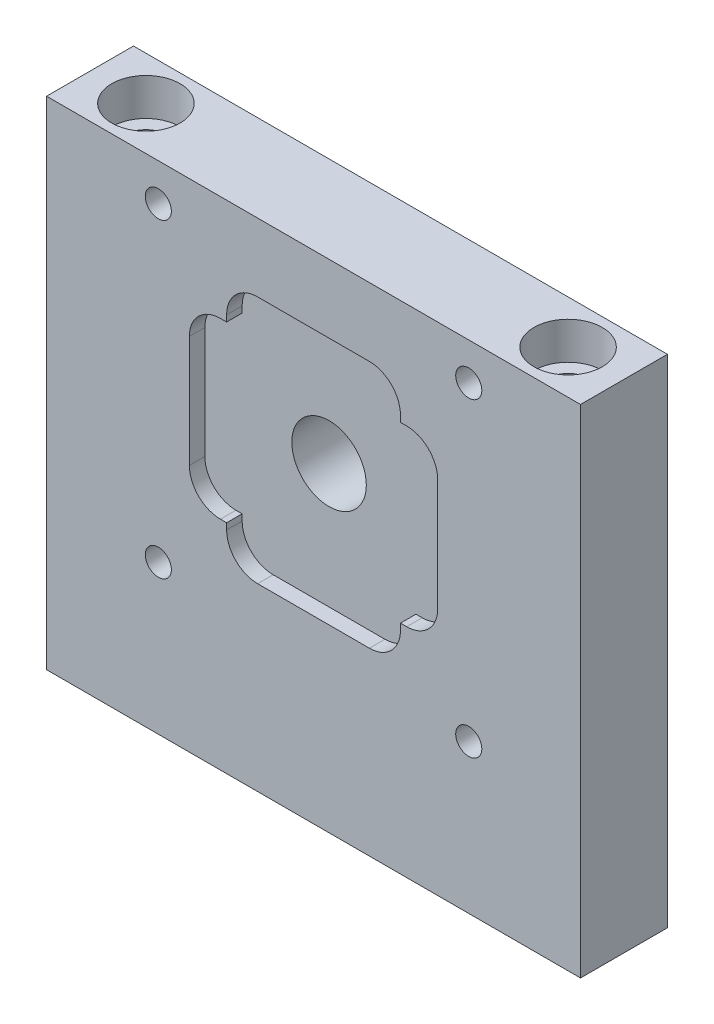
ISO-10303-21;
HEADER;
FILE_DESCRIPTION(('STEP AP214'),'2;1');
FILE_NAME('part.step','',(''),(''),'','','');
FILE_SCHEMA(('AUTOMOTIVE_DESIGN { 1 0 10303 214 1 1 1 1 }'));
ENDSEC;
DATA;
#1=APPLICATION_CONTEXT('core data for automotive mechanical design processes');
#2=APPLICATION_PROTOCOL_DEFINITION('international standard','automotive_design',2000,#1);
#3=PRODUCT_CONTEXT('',#1,'mechanical');
#4=PRODUCT('Part','Part','',(#3));
#5=PRODUCT_RELATED_PRODUCT_CATEGORY('part','',(#4));
#6=PRODUCT_DEFINITION_FORMATION('','',#4);
#7=PRODUCT_DEFINITION_CONTEXT('part definition',#1,'design');
#8=PRODUCT_DEFINITION('design','',#6,#7);
#9=PRODUCT_DEFINITION_SHAPE('','',#8);
#10=(LENGTH_UNIT() NAMED_UNIT(*) SI_UNIT(.MILLI.,.METRE.));
#11=(NAMED_UNIT(*) PLANE_ANGLE_UNIT() SI_UNIT($,.RADIAN.));
#12=(NAMED_UNIT(*) SI_UNIT($,.STERADIAN.) SOLID_ANGLE_UNIT());
#13=UNCERTAINTY_MEASURE_WITH_UNIT(LENGTH_MEASURE(1.E-05),#10,'distance_accuracy_value','');
#14=(GEOMETRIC_REPRESENTATION_CONTEXT(3) GLOBAL_UNCERTAINTY_ASSIGNED_CONTEXT((#13)) GLOBAL_UNIT_ASSIGNED_CONTEXT((#10,
#11,#12)) REPRESENTATION_CONTEXT('',''));
#15=CARTESIAN_POINT('',(0.,0.,0.));
#16=DIRECTION('',(0.,0.,1.));
#17=DIRECTION('',(1.,0.,0.));
#18=AXIS2_PLACEMENT_3D('',#15,#16,#17);
#19=CARTESIAN_POINT('',(0.,0.,14.));
#20=DIRECTION('',(1.,0.,0.));
#21=DIRECTION('',(0.,0.,-1.));
#22=AXIS2_PLACEMENT_3D('',#19,#20,#21);
#23=PLANE('',#22);
#24=DIRECTION('',(0.,-1.,0.));
#25=VECTOR('',#24,1.);
#26=CARTESIAN_POINT('',(0.,0.,0.));
#27=LINE('',#26,#25);
#28=CARTESIAN_POINT('',(0.,80.,0.));
#29=VERTEX_POINT('',#28);
#30=CARTESIAN_POINT('',(0.,0.,0.));
#31=VERTEX_POINT('',#30);
#32=EDGE_CURVE('E288',#29,#31,#27,.T.);
#33=ORIENTED_EDGE('',*,*,#32,.T.);
#34=DIRECTION('',(0.,0.,-1.));
#35=VECTOR('',#34,1.);
#36=CARTESIAN_POINT('',(0.,0.,14.));
#37=LINE('',#36,#35);
#38=CARTESIAN_POINT('',(0.,0.,14.));
#39=VERTEX_POINT('',#38);
#40=EDGE_CURVE('E315',#39,#31,#37,.T.);
#41=ORIENTED_EDGE('',*,*,#40,.F.);
#42=DIRECTION('',(0.,-1.,0.));
#43=VECTOR('',#42,1.);
#44=CARTESIAN_POINT('',(0.,0.,14.));
#45=LINE('',#44,#43);
#46=CARTESIAN_POINT('',(0.,80.,14.));
#47=VERTEX_POINT('',#46);
#48=EDGE_CURVE('E289',#47,#39,#45,.T.);
#49=ORIENTED_EDGE('',*,*,#48,.F.);
#50=DIRECTION('',(0.,0.,-1.));
#51=VECTOR('',#50,1.);
#52=CARTESIAN_POINT('',(0.,80.,14.));
#53=LINE('',#52,#51);
#54=EDGE_CURVE('E299',#47,#29,#53,.T.);
#55=ORIENTED_EDGE('',*,*,#54,.T.);
#56=EDGE_LOOP('',(#33,#41,#49,#55));
#57=FACE_BOUND('',#56,.T.);
#58=ADVANCED_FACE('F33',(#57),#23,.F.);
#59=CARTESIAN_POINT('',(0.,0.,14.));
#60=DIRECTION('',(0.,1.,0.));
#61=DIRECTION('',(0.,0.,1.));
#62=AXIS2_PLACEMENT_3D('',#59,#60,#61);
#63=PLANE('',#62);
#64=CARTESIAN_POINT('',(8.99999999999999,0.,7.));
#65=DIRECTION('',(0.,1.,0.));
#66=DIRECTION('',(0.,0.,1.));
#67=AXIS2_PLACEMENT_3D('',#64,#65,#66);
#68=CIRCLE('',#67,3.29999999999998);
#69=CARTESIAN_POINT('',(8.99999999999999,0.,10.3));
#70=VERTEX_POINT('',#69);
#71=EDGE_CURVE('E849',#70,#70,#68,.T.);
#72=ORIENTED_EDGE('',*,*,#71,.T.);
#73=EDGE_LOOP('',(#72));
#74=FACE_BOUND('',#73,.T.);
#75=CARTESIAN_POINT('',(77.,0.,7.));
#76=DIRECTION('',(0.,1.,0.));
#77=DIRECTION('',(0.,0.,1.));
#78=AXIS2_PLACEMENT_3D('',#75,#76,#77);
#79=CIRCLE('',#78,3.29999999999998);
#80=CARTESIAN_POINT('',(77.,0.,10.3));
#81=VERTEX_POINT('',#80);
#82=EDGE_CURVE('E248',#81,#81,#79,.T.);
#83=ORIENTED_EDGE('',*,*,#82,.T.);
#84=EDGE_LOOP('',(#83));
#85=FACE_BOUND('',#84,.T.);
#86=DIRECTION('',(1.,0.,0.));
#87=VECTOR('',#86,1.);
#88=CARTESIAN_POINT('',(0.,0.,0.));
#89=LINE('',#88,#87);
#90=CARTESIAN_POINT('',(86.,0.,0.));
#91=VERTEX_POINT('',#90);
#92=EDGE_CURVE('E302',#31,#91,#89,.T.);
#93=ORIENTED_EDGE('',*,*,#92,.T.);
#94=DIRECTION('',(0.,0.,-1.));
#95=VECTOR('',#94,1.);
#96=CARTESIAN_POINT('',(86.,0.,14.));
#97=LINE('',#96,#95);
#98=CARTESIAN_POINT('',(86.,0.,14.));
#99=VERTEX_POINT('',#98);
#100=EDGE_CURVE('E312',#99,#91,#97,.T.);
#101=ORIENTED_EDGE('',*,*,#100,.F.);
#102=DIRECTION('',(1.,0.,0.));
#103=VECTOR('',#102,1.);
#104=CARTESIAN_POINT('',(0.,0.,14.));
#105=LINE('',#104,#103);
#106=EDGE_CURVE('E292',#39,#99,#105,.T.);
#107=ORIENTED_EDGE('',*,*,#106,.F.);
#108=ORIENTED_EDGE('',*,*,#40,.T.);
#109=EDGE_LOOP('',(#93,#101,#107,#108));
#110=FACE_BOUND('',#109,.T.);
#111=ADVANCED_FACE('F467',(#74,#85,#110),#63,.F.);
#112=CARTESIAN_POINT('',(86.,0.,14.));
#113=DIRECTION('',(-1.,0.,0.));
#114=DIRECTION('',(0.,0.,1.));
#115=AXIS2_PLACEMENT_3D('',#112,#113,#114);
#116=PLANE('',#115);
#117=DIRECTION('',(0.,1.,0.));
#118=VECTOR('',#117,1.);
#119=CARTESIAN_POINT('',(86.,0.,0.));
#120=LINE('',#119,#118);
#121=CARTESIAN_POINT('',(86.,80.,0.));
#122=VERTEX_POINT('',#121);
#123=EDGE_CURVE('E304',#91,#122,#120,.T.);
#124=ORIENTED_EDGE('',*,*,#123,.T.);
#125=DIRECTION('',(0.,0.,-1.));
#126=VECTOR('',#125,1.);
#127=CARTESIAN_POINT('',(86.,80.,14.));
#128=LINE('',#127,#126);
#129=CARTESIAN_POINT('',(86.,80.,14.));
#130=VERTEX_POINT('',#129);
#131=EDGE_CURVE('E309',#130,#122,#128,.T.);
#132=ORIENTED_EDGE('',*,*,#131,.F.);
#133=DIRECTION('',(0.,1.,0.));
#134=VECTOR('',#133,1.);
#135=CARTESIAN_POINT('',(86.,0.,14.));
#136=LINE('',#135,#134);
#137=EDGE_CURVE('E295',#99,#130,#136,.T.);
#138=ORIENTED_EDGE('',*,*,#137,.F.);
#139=ORIENTED_EDGE('',*,*,#100,.T.);
#140=EDGE_LOOP('',(#124,#132,#138,#139));
#141=FACE_BOUND('',#140,.T.);
#142=ADVANCED_FACE('F473',(#141),#116,.F.);
#143=CARTESIAN_POINT('',(0.,80.,14.));
#144=DIRECTION('',(0.,-1.,0.));
#145=DIRECTION('',(0.,0.,-1.));
#146=AXIS2_PLACEMENT_3D('',#143,#144,#145);
#147=PLANE('',#146);
#148=CARTESIAN_POINT('',(8.99999999999999,80.,7.));
#149=DIRECTION('',(0.,1.,0.));
#150=DIRECTION('',(0.,0.,1.));
#151=AXIS2_PLACEMENT_3D('',#148,#149,#150);
#152=CIRCLE('',#151,5.5);
#153=CARTESIAN_POINT('',(8.99999999999999,80.,12.5));
#154=VERTEX_POINT('',#153);
#155=EDGE_CURVE('E840',#154,#154,#152,.T.);
#156=ORIENTED_EDGE('',*,*,#155,.F.);
#157=EDGE_LOOP('',(#156));
#158=FACE_BOUND('',#157,.T.);
#159=CARTESIAN_POINT('',(77.,80.,7.));
#160=DIRECTION('',(0.,1.,0.));
#161=DIRECTION('',(0.,0.,1.));
#162=AXIS2_PLACEMENT_3D('',#159,#160,#161);
#163=CIRCLE('',#162,5.50000000000001);
#164=CARTESIAN_POINT('',(77.,80.,12.5));
#165=VERTEX_POINT('',#164);
#166=EDGE_CURVE('E852',#165,#165,#163,.T.);
#167=ORIENTED_EDGE('',*,*,#166,.F.);
#168=EDGE_LOOP('',(#167));
#169=FACE_BOUND('',#168,.T.);
#170=DIRECTION('',(-1.,0.,0.));
#171=VECTOR('',#170,1.);
#172=CARTESIAN_POINT('',(0.,80.,0.));
#173=LINE('',#172,#171);
#174=EDGE_CURVE('E293',#122,#29,#173,.T.);
#175=ORIENTED_EDGE('',*,*,#174,.T.);
#176=ORIENTED_EDGE('',*,*,#54,.F.);
#177=DIRECTION('',(-1.,0.,0.));
#178=VECTOR('',#177,1.);
#179=CARTESIAN_POINT('',(0.,80.,14.));
#180=LINE('',#179,#178);
#181=EDGE_CURVE('E297',#130,#47,#180,.T.);
#182=ORIENTED_EDGE('',*,*,#181,.F.);
#183=ORIENTED_EDGE('',*,*,#131,.T.);
#184=EDGE_LOOP('',(#175,#176,#182,#183));
#185=FACE_BOUND('',#184,.T.);
#186=ADVANCED_FACE('F521',(#158,#169,#185),#147,.F.);
#187=CARTESIAN_POINT('',(0.,80.,14.));
#188=DIRECTION('',(0.,0.,-1.));
#189=DIRECTION('',(-1.,0.,0.));
#190=AXIS2_PLACEMENT_3D('',#187,#188,#189);
#191=PLANE('',#190);
#192=CARTESIAN_POINT('',(68.0000000000001,74.,14.));
#193=DIRECTION('',(0.,0.,1.));
#194=DIRECTION('',(1.,0.,0.));
#195=AXIS2_PLACEMENT_3D('',#192,#193,#194);
#196=CIRCLE('',#195,2.09999999999999);
#197=CARTESIAN_POINT('',(70.1000000000001,74.,14.));
#198=VERTEX_POINT('',#197);
#199=EDGE_CURVE('E818',#198,#198,#196,.T.);
#200=ORIENTED_EDGE('',*,*,#199,.F.);
#201=EDGE_LOOP('',(#200));
#202=FACE_BOUND('',#201,.T.);
#203=CARTESIAN_POINT('',(18.0000000000001,74.,14.));
#204=DIRECTION('',(0.,0.,1.));
#205=DIRECTION('',(1.,0.,0.));
#206=AXIS2_PLACEMENT_3D('',#203,#204,#205);
#207=CIRCLE('',#206,2.09999999999999);
#208=CARTESIAN_POINT('',(20.1000000000001,74.,14.));
#209=VERTEX_POINT('',#208);
#210=EDGE_CURVE('E820',#209,#209,#207,.T.);
#211=ORIENTED_EDGE('',*,*,#210,.F.);
#212=EDGE_LOOP('',(#211));
#213=FACE_BOUND('',#212,.T.);
#214=CARTESIAN_POINT('',(18.0000000000001,24.,14.));
#215=DIRECTION('',(0.,0.,1.));
#216=DIRECTION('',(1.,0.,0.));
#217=AXIS2_PLACEMENT_3D('',#214,#215,#216);
#218=CIRCLE('',#217,2.09999999999999);
#219=CARTESIAN_POINT('',(20.1000000000001,24.,14.));
#220=VERTEX_POINT('',#219);
#221=EDGE_CURVE('E828',#220,#220,#218,.T.);
#222=ORIENTED_EDGE('',*,*,#221,.F.);
#223=EDGE_LOOP('',(#222));
#224=FACE_BOUND('',#223,.T.);
#225=CARTESIAN_POINT('',(68.0000000000001,24.,14.));
#226=DIRECTION('',(0.,0.,1.));
#227=DIRECTION('',(1.,0.,0.));
#228=AXIS2_PLACEMENT_3D('',#225,#226,#227);
#229=CIRCLE('',#228,2.09999999999999);
#230=CARTESIAN_POINT('',(70.1000000000001,24.,14.));
#231=VERTEX_POINT('',#230);
#232=EDGE_CURVE('E834',#231,#231,#229,.T.);
#233=ORIENTED_EDGE('',*,*,#232,.F.);
#234=EDGE_LOOP('',(#233));
#235=FACE_BOUND('',#234,.T.);
#236=DIRECTION('',(-1.,0.,0.));
#237=VECTOR('',#236,1.);
#238=CARTESIAN_POINT('',(29.,63.,14.));
#239=LINE('',#238,#237);
#240=CARTESIAN_POINT('',(29.,63.,14.));
#241=VERTEX_POINT('',#240);
#242=CARTESIAN_POINT('',(28.,63.,14.));
#243=VERTEX_POINT('',#242);
#244=EDGE_CURVE('E247',#241,#243,#239,.T.);
#245=ORIENTED_EDGE('',*,*,#244,.F.);
#246=DIRECTION('',(0.,-1.,0.));
#247=VECTOR('',#246,1.);
#248=CARTESIAN_POINT('',(29.,69.,14.));
#249=LINE('',#248,#247);
#250=CARTESIAN_POINT('',(29.,64.,14.));
#251=VERTEX_POINT('',#250);
#252=EDGE_CURVE('E211',#251,#241,#249,.T.);
#253=ORIENTED_EDGE('',*,*,#252,.F.);
#254=CARTESIAN_POINT('',(34.,64.,14.));
#255=DIRECTION('',(0.,0.,-1.));
#256=DIRECTION('',(-1.,0.,0.));
#257=AXIS2_PLACEMENT_3D('',#254,#255,#256);
#258=CIRCLE('',#257,5.);
#259=CARTESIAN_POINT('',(34.,69.,14.));
#260=VERTEX_POINT('',#259);
#261=EDGE_CURVE('E11',#251,#260,#258,.T.);
#262=ORIENTED_EDGE('',*,*,#261,.T.);
#263=DIRECTION('',(-1.,0.,0.));
#264=VECTOR('',#263,1.);
#265=CARTESIAN_POINT('',(57.,69.,14.));
#266=LINE('',#265,#264);
#267=CARTESIAN_POINT('',(52.,69.,14.));
#268=VERTEX_POINT('',#267);
#269=EDGE_CURVE('E205',#268,#260,#266,.T.);
#270=ORIENTED_EDGE('',*,*,#269,.F.);
#271=CARTESIAN_POINT('',(52.,64.,14.));
#272=DIRECTION('',(0.,0.,-1.));
#273=DIRECTION('',(-1.,0.,0.));
#274=AXIS2_PLACEMENT_3D('',#271,#272,#273);
#275=CIRCLE('',#274,5.);
#276=CARTESIAN_POINT('',(57.,64.,14.));
#277=VERTEX_POINT('',#276);
#278=EDGE_CURVE('E373',#268,#277,#275,.T.);
#279=ORIENTED_EDGE('',*,*,#278,.T.);
#280=DIRECTION('',(0.,1.,0.));
#281=VECTOR('',#280,1.);
#282=CARTESIAN_POINT('',(57.,69.,14.));
#283=LINE('',#282,#281);
#284=CARTESIAN_POINT('',(57.,63.,14.));
#285=VERTEX_POINT('',#284);
#286=EDGE_CURVE('E271',#285,#277,#283,.T.);
#287=ORIENTED_EDGE('',*,*,#286,.F.);
#288=DIRECTION('',(-1.,0.,0.));
#289=VECTOR('',#288,1.);
#290=CARTESIAN_POINT('',(57.,63.,14.));
#291=LINE('',#290,#289);
#292=CARTESIAN_POINT('',(58.,63.,14.));
#293=VERTEX_POINT('',#292);
#294=EDGE_CURVE('E269',#293,#285,#291,.T.);
#295=ORIENTED_EDGE('',*,*,#294,.F.);
#296=CARTESIAN_POINT('',(58.,58.,14.));
#297=DIRECTION('',(0.,0.,-1.));
#298=DIRECTION('',(-1.,0.,0.));
#299=AXIS2_PLACEMENT_3D('',#296,#297,#298);
#300=CIRCLE('',#299,5.);
#301=CARTESIAN_POINT('',(63.,58.,14.));
#302=VERTEX_POINT('',#301);
#303=EDGE_CURVE('E375',#293,#302,#300,.T.);
#304=ORIENTED_EDGE('',*,*,#303,.T.);
#305=DIRECTION('',(0.,1.,0.));
#306=VECTOR('',#305,1.);
#307=CARTESIAN_POINT('',(63.,63.,14.));
#308=LINE('',#307,#306);
#309=CARTESIAN_POINT('',(63.,40.,14.));
#310=VERTEX_POINT('',#309);
#311=EDGE_CURVE('E266',#310,#302,#308,.T.);
#312=ORIENTED_EDGE('',*,*,#311,.F.);
#313=CARTESIAN_POINT('',(58.,40.,14.));
#314=DIRECTION('',(0.,0.,-1.));
#315=DIRECTION('',(-1.,0.,0.));
#316=AXIS2_PLACEMENT_3D('',#313,#314,#315);
#317=CIRCLE('',#316,5.);
#318=CARTESIAN_POINT('',(58.,35.,14.));
#319=VERTEX_POINT('',#318);
#320=EDGE_CURVE('E377',#310,#319,#317,.T.);
#321=ORIENTED_EDGE('',*,*,#320,.T.);
#322=DIRECTION('',(1.,0.,0.));
#323=VECTOR('',#322,1.);
#324=CARTESIAN_POINT('',(57.,35.,14.));
#325=LINE('',#324,#323);
#326=CARTESIAN_POINT('',(57.,35.,14.));
#327=VERTEX_POINT('',#326);
#328=EDGE_CURVE('E263',#327,#319,#325,.T.);
#329=ORIENTED_EDGE('',*,*,#328,.F.);
#330=DIRECTION('',(0.,1.,0.));
#331=VECTOR('',#330,1.);
#332=CARTESIAN_POINT('',(57.,29.,14.));
#333=LINE('',#332,#331);
#334=CARTESIAN_POINT('',(57.,34.,14.));
#335=VERTEX_POINT('',#334);
#336=EDGE_CURVE('E261',#335,#327,#333,.T.);
#337=ORIENTED_EDGE('',*,*,#336,.F.);
#338=CARTESIAN_POINT('',(52.,34.,14.));
#339=DIRECTION('',(0.,0.,-1.));
#340=DIRECTION('',(-1.,0.,0.));
#341=AXIS2_PLACEMENT_3D('',#338,#339,#340);
#342=CIRCLE('',#341,5.);
#343=CARTESIAN_POINT('',(52.,29.,14.));
#344=VERTEX_POINT('',#343);
#345=EDGE_CURVE('E379',#335,#344,#342,.T.);
#346=ORIENTED_EDGE('',*,*,#345,.T.);
#347=DIRECTION('',(1.,0.,0.));
#348=VECTOR('',#347,1.);
#349=CARTESIAN_POINT('',(57.,29.,14.));
#350=LINE('',#349,#348);
#351=CARTESIAN_POINT('',(34.,29.,14.));
#352=VERTEX_POINT('',#351);
#353=EDGE_CURVE('E258',#352,#344,#350,.T.);
#354=ORIENTED_EDGE('',*,*,#353,.F.);
#355=CARTESIAN_POINT('',(34.,34.,14.));
#356=DIRECTION('',(0.,0.,-1.));
#357=DIRECTION('',(-1.,0.,0.));
#358=AXIS2_PLACEMENT_3D('',#355,#356,#357);
#359=CIRCLE('',#358,5.);
#360=CARTESIAN_POINT('',(29.,34.,14.));
#361=VERTEX_POINT('',#360);
#362=EDGE_CURVE('E381',#352,#361,#359,.T.);
#363=ORIENTED_EDGE('',*,*,#362,.T.);
#364=DIRECTION('',(0.,-1.,0.));
#365=VECTOR('',#364,1.);
#366=CARTESIAN_POINT('',(29.,29.,14.));
#367=LINE('',#366,#365);
#368=CARTESIAN_POINT('',(29.,35.,14.));
#369=VERTEX_POINT('',#368);
#370=EDGE_CURVE('E255',#369,#361,#367,.T.);
#371=ORIENTED_EDGE('',*,*,#370,.F.);
#372=DIRECTION('',(1.,0.,0.));
#373=VECTOR('',#372,1.);
#374=CARTESIAN_POINT('',(29.,35.,14.));
#375=LINE('',#374,#373);
#376=CARTESIAN_POINT('',(28.,35.,14.));
#377=VERTEX_POINT('',#376);
#378=EDGE_CURVE('E253',#377,#369,#375,.T.);
#379=ORIENTED_EDGE('',*,*,#378,.F.);
#380=CARTESIAN_POINT('',(28.,40.,14.));
#381=DIRECTION('',(0.,0.,-1.));
#382=DIRECTION('',(-1.,0.,0.));
#383=AXIS2_PLACEMENT_3D('',#380,#381,#382);
#384=CIRCLE('',#383,5.);
#385=CARTESIAN_POINT('',(23.,40.,14.));
#386=VERTEX_POINT('',#385);
#387=EDGE_CURVE('E383',#377,#386,#384,.T.);
#388=ORIENTED_EDGE('',*,*,#387,.T.);
#389=DIRECTION('',(0.,-1.,0.));
#390=VECTOR('',#389,1.);
#391=CARTESIAN_POINT('',(23.,63.,14.));
#392=LINE('',#391,#390);
#393=CARTESIAN_POINT('',(23.,58.,14.));
#394=VERTEX_POINT('',#393);
#395=EDGE_CURVE('E250',#394,#386,#392,.T.);
#396=ORIENTED_EDGE('',*,*,#395,.F.);
#397=CARTESIAN_POINT('',(28.,58.,14.));
#398=DIRECTION('',(0.,0.,-1.));
#399=DIRECTION('',(-1.,0.,0.));
#400=AXIS2_PLACEMENT_3D('',#397,#398,#399);
#401=CIRCLE('',#400,5.);
#402=EDGE_CURVE('E41',#394,#243,#401,.T.);
#403=ORIENTED_EDGE('',*,*,#402,.T.);
#404=EDGE_LOOP('',(#245,#253,#262,#270,#279,#287,#295,#304,#312,#321,#329,#337,#346,#354,#363,
#371,#379,#388,#396,#403));
#405=FACE_BOUND('',#404,.T.);
#406=ORIENTED_EDGE('',*,*,#48,.T.);
#407=ORIENTED_EDGE('',*,*,#106,.T.);
#408=ORIENTED_EDGE('',*,*,#137,.T.);
#409=ORIENTED_EDGE('',*,*,#181,.T.);
#410=EDGE_LOOP('',(#406,#407,#408,#409));
#411=FACE_BOUND('',#410,.T.);
#412=ADVANCED_FACE('F385',(#202,#213,#224,#235,#405,#411),#191,.F.);
#413=CARTESIAN_POINT('',(0.,80.,0.));
#414=DIRECTION('',(0.,0.,-1.));
#415=DIRECTION('',(-1.,0.,0.));
#416=AXIS2_PLACEMENT_3D('',#413,#414,#415);
#417=PLANE('',#416);
#418=CARTESIAN_POINT('',(68.0000000000001,74.,0.));
#419=DIRECTION('',(0.,0.,1.));
#420=DIRECTION('',(1.,0.,0.));
#421=AXIS2_PLACEMENT_3D('',#418,#419,#420);
#422=CIRCLE('',#421,2.09999999999999);
#423=CARTESIAN_POINT('',(70.1000000000001,74.,0.));
#424=VERTEX_POINT('',#423);
#425=EDGE_CURVE('E815',#424,#424,#422,.T.);
#426=ORIENTED_EDGE('',*,*,#425,.T.);
#427=EDGE_LOOP('',(#426));
#428=FACE_BOUND('',#427,.T.);
#429=CARTESIAN_POINT('',(18.0000000000001,74.,0.));
#430=DIRECTION('',(0.,0.,1.));
#431=DIRECTION('',(1.,0.,0.));
#432=AXIS2_PLACEMENT_3D('',#429,#430,#431);
#433=CIRCLE('',#432,2.1);
#434=CARTESIAN_POINT('',(20.1000000000001,74.,0.));
#435=VERTEX_POINT('',#434);
#436=EDGE_CURVE('E825',#435,#435,#433,.T.);
#437=ORIENTED_EDGE('',*,*,#436,.T.);
#438=EDGE_LOOP('',(#437));
#439=FACE_BOUND('',#438,.T.);
#440=CARTESIAN_POINT('',(18.0000000000001,24.,0.));
#441=DIRECTION('',(0.,0.,1.));
#442=DIRECTION('',(1.,0.,0.));
#443=AXIS2_PLACEMENT_3D('',#440,#441,#442);
#444=CIRCLE('',#443,2.1);
#445=CARTESIAN_POINT('',(20.1000000000001,24.,0.));
#446=VERTEX_POINT('',#445);
#447=EDGE_CURVE('E831',#446,#446,#444,.T.);
#448=ORIENTED_EDGE('',*,*,#447,.T.);
#449=EDGE_LOOP('',(#448));
#450=FACE_BOUND('',#449,.T.);
#451=CARTESIAN_POINT('',(68.0000000000001,24.,0.));
#452=DIRECTION('',(0.,0.,1.));
#453=DIRECTION('',(1.,0.,0.));
#454=AXIS2_PLACEMENT_3D('',#451,#452,#453);
#455=CIRCLE('',#454,2.09999999999999);
#456=CARTESIAN_POINT('',(70.1000000000001,24.,0.));
#457=VERTEX_POINT('',#456);
#458=EDGE_CURVE('E837',#457,#457,#455,.T.);
#459=ORIENTED_EDGE('',*,*,#458,.T.);
#460=EDGE_LOOP('',(#459));
#461=FACE_BOUND('',#460,.T.);
#462=CARTESIAN_POINT('',(43.,49.,0.));
#463=DIRECTION('',(0.,0.,1.));
#464=DIRECTION('',(1.,0.,0.));
#465=AXIS2_PLACEMENT_3D('',#462,#463,#464);
#466=CIRCLE('',#465,6.);
#467=CARTESIAN_POINT('',(49.,49.,0.));
#468=VERTEX_POINT('',#467);
#469=EDGE_CURVE('E285',#468,#468,#466,.T.);
#470=ORIENTED_EDGE('',*,*,#469,.T.);
#471=EDGE_LOOP('',(#470));
#472=FACE_BOUND('',#471,.T.);
#473=ORIENTED_EDGE('',*,*,#32,.F.);
#474=ORIENTED_EDGE('',*,*,#174,.F.);
#475=ORIENTED_EDGE('',*,*,#123,.F.);
#476=ORIENTED_EDGE('',*,*,#92,.F.);
#477=EDGE_LOOP('',(#473,#474,#475,#476));
#478=FACE_BOUND('',#477,.T.);
#479=ADVANCED_FACE('F595',(#428,#439,#450,#461,#472,#478),#417,.T.);
#480=CARTESIAN_POINT('',(43.,49.,0.));
#481=DIRECTION('',(0.,0.,1.));
#482=DIRECTION('',(1.,0.,0.));
#483=AXIS2_PLACEMENT_3D('',#480,#481,#482);
#484=CYLINDRICAL_SURFACE('',#483,6.);
#485=CARTESIAN_POINT('',(43.,49.,11.5));
#486=DIRECTION('',(0.,0.,-1.));
#487=DIRECTION('',(-1.,0.,0.));
#488=AXIS2_PLACEMENT_3D('',#485,#486,#487);
#489=CIRCLE('',#488,6.);
#490=CARTESIAN_POINT('',(37.,49.,11.5));
#491=VERTEX_POINT('',#490);
#492=EDGE_CURVE('E279',#491,#491,#489,.F.);
#493=ORIENTED_EDGE('',*,*,#492,.T.);
#494=EDGE_LOOP('',(#493));
#495=FACE_BOUND('',#494,.T.);
#496=ORIENTED_EDGE('',*,*,#469,.F.);
#497=EDGE_LOOP('',(#496));
#498=FACE_BOUND('',#497,.T.);
#499=ADVANCED_FACE('F605',(#495,#498),#484,.F.);
#500=CARTESIAN_POINT('',(29.,63.,11.5));
#501=DIRECTION('',(0.,0.,-1.));
#502=DIRECTION('',(-1.,0.,0.));
#503=AXIS2_PLACEMENT_3D('',#500,#501,#502);
#504=PLANE('',#503);
#505=DIRECTION('',(0.,1.,0.));
#506=VECTOR('',#505,1.);
#507=CARTESIAN_POINT('',(57.,69.,11.5));
#508=LINE('',#507,#506);
#509=CARTESIAN_POINT('',(57.,63.,11.5));
#510=VERTEX_POINT('',#509);
#511=CARTESIAN_POINT('',(57.,64.,11.5));
#512=VERTEX_POINT('',#511);
#513=EDGE_CURVE('E243',#510,#512,#508,.T.);
#514=ORIENTED_EDGE('',*,*,#513,.T.);
#515=CARTESIAN_POINT('',(52.,64.,11.5));
#516=DIRECTION('',(0.,0.,-1.));
#517=DIRECTION('',(-1.,0.,0.));
#518=AXIS2_PLACEMENT_3D('',#515,#516,#517);
#519=CIRCLE('',#518,5.);
#520=CARTESIAN_POINT('',(52.,69.,11.5));
#521=VERTEX_POINT('',#520);
#522=EDGE_CURVE('E340',#512,#521,#519,.F.);
#523=ORIENTED_EDGE('',*,*,#522,.T.);
#524=DIRECTION('',(-1.,0.,0.));
#525=VECTOR('',#524,1.);
#526=CARTESIAN_POINT('',(57.,69.,11.5));
#527=LINE('',#526,#525);
#528=CARTESIAN_POINT('',(34.,69.,11.5));
#529=VERTEX_POINT('',#528);
#530=EDGE_CURVE('E214',#521,#529,#527,.T.);
#531=ORIENTED_EDGE('',*,*,#530,.T.);
#532=CARTESIAN_POINT('',(34.,64.,11.5));
#533=DIRECTION('',(0.,0.,-1.));
#534=DIRECTION('',(-1.,0.,0.));
#535=AXIS2_PLACEMENT_3D('',#532,#533,#534);
#536=CIRCLE('',#535,5.);
#537=CARTESIAN_POINT('',(29.,64.,11.5));
#538=VERTEX_POINT('',#537);
#539=EDGE_CURVE('E203',#529,#538,#536,.F.);
#540=ORIENTED_EDGE('',*,*,#539,.T.);
#541=DIRECTION('',(0.,-1.,0.));
#542=VECTOR('',#541,1.);
#543=CARTESIAN_POINT('',(29.,69.,11.5));
#544=LINE('',#543,#542);
#545=CARTESIAN_POINT('',(29.,63.,11.5));
#546=VERTEX_POINT('',#545);
#547=EDGE_CURVE('E193',#538,#546,#544,.T.);
#548=ORIENTED_EDGE('',*,*,#547,.T.);
#549=DIRECTION('',(-1.,0.,0.));
#550=VECTOR('',#549,1.);
#551=CARTESIAN_POINT('',(29.,63.,11.5));
#552=LINE('',#551,#550);
#553=CARTESIAN_POINT('',(28.,63.,11.5));
#554=VERTEX_POINT('',#553);
#555=EDGE_CURVE('E199',#546,#554,#552,.T.);
#556=ORIENTED_EDGE('',*,*,#555,.T.);
#557=CARTESIAN_POINT('',(28.,58.,11.5));
#558=DIRECTION('',(0.,0.,-1.));
#559=DIRECTION('',(-1.,0.,0.));
#560=AXIS2_PLACEMENT_3D('',#557,#558,#559);
#561=CIRCLE('',#560,5.);
#562=CARTESIAN_POINT('',(23.,58.,11.5));
#563=VERTEX_POINT('',#562);
#564=EDGE_CURVE('E328',#554,#563,#561,.F.);
#565=ORIENTED_EDGE('',*,*,#564,.T.);
#566=DIRECTION('',(0.,-1.,0.));
#567=VECTOR('',#566,1.);
#568=CARTESIAN_POINT('',(23.,63.,11.5));
#569=LINE('',#568,#567);
#570=CARTESIAN_POINT('',(23.,40.,11.5));
#571=VERTEX_POINT('',#570);
#572=EDGE_CURVE('E219',#563,#571,#569,.T.);
#573=ORIENTED_EDGE('',*,*,#572,.T.);
#574=CARTESIAN_POINT('',(28.,40.,11.5));
#575=DIRECTION('',(0.,0.,-1.));
#576=DIRECTION('',(-1.,0.,0.));
#577=AXIS2_PLACEMENT_3D('',#574,#575,#576);
#578=CIRCLE('',#577,5.);
#579=CARTESIAN_POINT('',(28.,35.,11.5));
#580=VERTEX_POINT('',#579);
#581=EDGE_CURVE('E330',#571,#580,#578,.F.);
#582=ORIENTED_EDGE('',*,*,#581,.T.);
#583=DIRECTION('',(1.,0.,0.));
#584=VECTOR('',#583,1.);
#585=CARTESIAN_POINT('',(29.,35.,11.5));
#586=LINE('',#585,#584);
#587=CARTESIAN_POINT('',(29.,35.,11.5));
#588=VERTEX_POINT('',#587);
#589=EDGE_CURVE('E222',#580,#588,#586,.T.);
#590=ORIENTED_EDGE('',*,*,#589,.T.);
#591=DIRECTION('',(0.,-1.,0.));
#592=VECTOR('',#591,1.);
#593=CARTESIAN_POINT('',(29.,29.,11.5));
#594=LINE('',#593,#592);
#595=CARTESIAN_POINT('',(29.,34.,11.5));
#596=VERTEX_POINT('',#595);
#597=EDGE_CURVE('E227',#588,#596,#594,.T.);
#598=ORIENTED_EDGE('',*,*,#597,.T.);
#599=CARTESIAN_POINT('',(34.,34.,11.5));
#600=DIRECTION('',(0.,0.,-1.));
#601=DIRECTION('',(-1.,0.,0.));
#602=AXIS2_PLACEMENT_3D('',#599,#600,#601);
#603=CIRCLE('',#602,5.);
#604=CARTESIAN_POINT('',(34.,29.,11.5));
#605=VERTEX_POINT('',#604);
#606=EDGE_CURVE('E332',#596,#605,#603,.F.);
#607=ORIENTED_EDGE('',*,*,#606,.T.);
#608=DIRECTION('',(1.,0.,0.));
#609=VECTOR('',#608,1.);
#610=CARTESIAN_POINT('',(57.,29.,11.5));
#611=LINE('',#610,#609);
#612=CARTESIAN_POINT('',(52.,29.,11.5));
#613=VERTEX_POINT('',#612);
#614=EDGE_CURVE('E230',#605,#613,#611,.T.);
#615=ORIENTED_EDGE('',*,*,#614,.T.);
#616=CARTESIAN_POINT('',(52.,34.,11.5));
#617=DIRECTION('',(0.,0.,-1.));
#618=DIRECTION('',(-1.,0.,0.));
#619=AXIS2_PLACEMENT_3D('',#616,#617,#618);
#620=CIRCLE('',#619,5.);
#621=CARTESIAN_POINT('',(57.,34.,11.5));
#622=VERTEX_POINT('',#621);
#623=EDGE_CURVE('E334',#613,#622,#620,.F.);
#624=ORIENTED_EDGE('',*,*,#623,.T.);
#625=DIRECTION('',(0.,1.,0.));
#626=VECTOR('',#625,1.);
#627=CARTESIAN_POINT('',(57.,29.,11.5));
#628=LINE('',#627,#626);
#629=CARTESIAN_POINT('',(57.,35.,11.5));
#630=VERTEX_POINT('',#629);
#631=EDGE_CURVE('E233',#622,#630,#628,.T.);
#632=ORIENTED_EDGE('',*,*,#631,.T.);
#633=DIRECTION('',(1.,0.,0.));
#634=VECTOR('',#633,1.);
#635=CARTESIAN_POINT('',(57.,35.,11.5));
#636=LINE('',#635,#634);
#637=CARTESIAN_POINT('',(58.,35.,11.5));
#638=VERTEX_POINT('',#637);
#639=EDGE_CURVE('E235',#630,#638,#636,.T.);
#640=ORIENTED_EDGE('',*,*,#639,.T.);
#641=CARTESIAN_POINT('',(58.,40.,11.5));
#642=DIRECTION('',(0.,0.,-1.));
#643=DIRECTION('',(-1.,0.,0.));
#644=AXIS2_PLACEMENT_3D('',#641,#642,#643);
#645=CIRCLE('',#644,5.);
#646=CARTESIAN_POINT('',(63.,40.,11.5));
#647=VERTEX_POINT('',#646);
#648=EDGE_CURVE('E336',#638,#647,#645,.F.);
#649=ORIENTED_EDGE('',*,*,#648,.T.);
#650=DIRECTION('',(0.,1.,0.));
#651=VECTOR('',#650,1.);
#652=CARTESIAN_POINT('',(63.,63.,11.5));
#653=LINE('',#652,#651);
#654=CARTESIAN_POINT('',(63.,58.,11.5));
#655=VERTEX_POINT('',#654);
#656=EDGE_CURVE('E238',#647,#655,#653,.T.);
#657=ORIENTED_EDGE('',*,*,#656,.T.);
#658=CARTESIAN_POINT('',(58.,58.,11.5));
#659=DIRECTION('',(0.,0.,-1.));
#660=DIRECTION('',(-1.,0.,0.));
#661=AXIS2_PLACEMENT_3D('',#658,#659,#660);
#662=CIRCLE('',#661,5.);
#663=CARTESIAN_POINT('',(58.,63.,11.5));
#664=VERTEX_POINT('',#663);
#665=EDGE_CURVE('E338',#655,#664,#662,.F.);
#666=ORIENTED_EDGE('',*,*,#665,.T.);
#667=DIRECTION('',(-1.,0.,0.));
#668=VECTOR('',#667,1.);
#669=CARTESIAN_POINT('',(57.,63.,11.5));
#670=LINE('',#669,#668);
#671=EDGE_CURVE('E241',#664,#510,#670,.T.);
#672=ORIENTED_EDGE('',*,*,#671,.T.);
#673=EDGE_LOOP('',(#514,#523,#531,#540,#548,#556,#565,#573,#582,#590,#598,#607,#615,#624,#632,
#640,#649,#657,#666,#672));
#674=FACE_BOUND('',#673,.T.);
#675=ORIENTED_EDGE('',*,*,#492,.F.);
#676=EDGE_LOOP('',(#675));
#677=FACE_BOUND('',#676,.T.);
#678=ADVANCED_FACE('F196',(#674,#677),#504,.F.);
#679=CARTESIAN_POINT('',(29.,69.,11.5));
#680=DIRECTION('',(-1.,0.,0.));
#681=DIRECTION('',(0.,-1.,0.));
#682=AXIS2_PLACEMENT_3D('',#679,#680,#681);
#683=PLANE('',#682);
#684=ORIENTED_EDGE('',*,*,#547,.F.);
#685=DIRECTION('',(0.,0.,1.));
#686=VECTOR('',#685,1.);
#687=CARTESIAN_POINT('',(29.,64.,14.));
#688=LINE('',#687,#686);
#689=EDGE_CURVE('E371',#538,#251,#688,.T.);
#690=ORIENTED_EDGE('',*,*,#689,.T.);
#691=ORIENTED_EDGE('',*,*,#252,.T.);
#692=DIRECTION('',(0.,0.,1.));
#693=VECTOR('',#692,1.);
#694=CARTESIAN_POINT('',(29.,63.,11.5));
#695=LINE('',#694,#693);
#696=EDGE_CURVE('E208',#546,#241,#695,.T.);
#697=ORIENTED_EDGE('',*,*,#696,.F.);
#698=EDGE_LOOP('',(#684,#690,#691,#697));
#699=FACE_BOUND('',#698,.T.);
#700=ADVANCED_FACE('F209',(#699),#683,.F.);
#701=CARTESIAN_POINT('',(57.,69.,11.5));
#702=DIRECTION('',(0.,1.,0.));
#703=DIRECTION('',(0.,0.,1.));
#704=AXIS2_PLACEMENT_3D('',#701,#702,#703);
#705=PLANE('',#704);
#706=ORIENTED_EDGE('',*,*,#530,.F.);
#707=DIRECTION('',(0.,0.,1.));
#708=VECTOR('',#707,1.);
#709=CARTESIAN_POINT('',(52.,69.,14.));
#710=LINE('',#709,#708);
#711=EDGE_CURVE('E322',#521,#268,#710,.T.);
#712=ORIENTED_EDGE('',*,*,#711,.T.);
#713=ORIENTED_EDGE('',*,*,#269,.T.);
#714=DIRECTION('',(0.,0.,1.));
#715=VECTOR('',#714,1.);
#716=CARTESIAN_POINT('',(34.,69.,11.5));
#717=LINE('',#716,#715);
#718=EDGE_CURVE('E318',#260,#529,#717,.F.);
#719=ORIENTED_EDGE('',*,*,#718,.T.);
#720=EDGE_LOOP('',(#706,#712,#713,#719));
#721=FACE_BOUND('',#720,.T.);
#722=ADVANCED_FACE('F456',(#721),#705,.F.);
#723=CARTESIAN_POINT('',(57.,69.,11.5));
#724=DIRECTION('',(1.,0.,0.));
#725=DIRECTION('',(0.,0.,-1.));
#726=AXIS2_PLACEMENT_3D('',#723,#724,#725);
#727=PLANE('',#726);
#728=ORIENTED_EDGE('',*,*,#286,.T.);
#729=DIRECTION('',(0.,0.,1.));
#730=VECTOR('',#729,1.);
#731=CARTESIAN_POINT('',(57.,64.,11.5));
#732=LINE('',#731,#730);
#733=EDGE_CURVE('E325',#277,#512,#732,.F.);
#734=ORIENTED_EDGE('',*,*,#733,.T.);
#735=ORIENTED_EDGE('',*,*,#513,.F.);
#736=DIRECTION('',(0.,0.,1.));
#737=VECTOR('',#736,1.);
#738=CARTESIAN_POINT('',(57.,63.,11.5));
#739=LINE('',#738,#737);
#740=EDGE_CURVE('E276',#510,#285,#739,.T.);
#741=ORIENTED_EDGE('',*,*,#740,.T.);
#742=EDGE_LOOP('',(#728,#734,#735,#741));
#743=FACE_BOUND('',#742,.T.);
#744=ADVANCED_FACE('F656',(#743),#727,.F.);
#745=CARTESIAN_POINT('',(57.,63.,11.5));
#746=DIRECTION('',(0.,1.,0.));
#747=DIRECTION('',(0.,0.,1.));
#748=AXIS2_PLACEMENT_3D('',#745,#746,#747);
#749=PLANE('',#748);
#750=ORIENTED_EDGE('',*,*,#671,.F.);
#751=DIRECTION('',(0.,0.,1.));
#752=VECTOR('',#751,1.);
#753=CARTESIAN_POINT('',(58.,63.,14.));
#754=LINE('',#753,#752);
#755=EDGE_CURVE('E342',#664,#293,#754,.T.);
#756=ORIENTED_EDGE('',*,*,#755,.T.);
#757=ORIENTED_EDGE('',*,*,#294,.T.);
#758=ORIENTED_EDGE('',*,*,#740,.F.);
#759=EDGE_LOOP('',(#750,#756,#757,#758));
#760=FACE_BOUND('',#759,.T.);
#761=ADVANCED_FACE('F444',(#760),#749,.F.);
#762=CARTESIAN_POINT('',(63.,63.,11.5));
#763=DIRECTION('',(1.,0.,0.));
#764=DIRECTION('',(0.,0.,-1.));
#765=AXIS2_PLACEMENT_3D('',#762,#763,#764);
#766=PLANE('',#765);
#767=ORIENTED_EDGE('',*,*,#311,.T.);
#768=DIRECTION('',(0.,0.,1.));
#769=VECTOR('',#768,1.);
#770=CARTESIAN_POINT('',(63.,58.,11.5));
#771=LINE('',#770,#769);
#772=EDGE_CURVE('E348',#302,#655,#771,.F.);
#773=ORIENTED_EDGE('',*,*,#772,.T.);
#774=ORIENTED_EDGE('',*,*,#656,.F.);
#775=DIRECTION('',(0.,0.,1.));
#776=VECTOR('',#775,1.);
#777=CARTESIAN_POINT('',(63.,40.,14.));
#778=LINE('',#777,#776);
#779=EDGE_CURVE('E345',#647,#310,#778,.T.);
#780=ORIENTED_EDGE('',*,*,#779,.T.);
#781=EDGE_LOOP('',(#767,#773,#774,#780));
#782=FACE_BOUND('',#781,.T.);
#783=ADVANCED_FACE('F434',(#782),#766,.F.);
#784=CARTESIAN_POINT('',(57.,35.,11.5));
#785=DIRECTION('',(0.,-1.,0.));
#786=DIRECTION('',(1.,0.,0.));
#787=AXIS2_PLACEMENT_3D('',#784,#785,#786);
#788=PLANE('',#787);
#789=ORIENTED_EDGE('',*,*,#328,.T.);
#790=DIRECTION('',(0.,0.,1.));
#791=VECTOR('',#790,1.);
#792=CARTESIAN_POINT('',(58.,35.,11.5));
#793=LINE('',#792,#791);
#794=EDGE_CURVE('E350',#319,#638,#793,.F.);
#795=ORIENTED_EDGE('',*,*,#794,.T.);
#796=ORIENTED_EDGE('',*,*,#639,.F.);
#797=DIRECTION('',(0.,0.,1.));
#798=VECTOR('',#797,1.);
#799=CARTESIAN_POINT('',(57.,35.,11.5));
#800=LINE('',#799,#798);
#801=EDGE_CURVE('E280',#630,#327,#800,.T.);
#802=ORIENTED_EDGE('',*,*,#801,.T.);
#803=EDGE_LOOP('',(#789,#795,#796,#802));
#804=FACE_BOUND('',#803,.T.);
#805=ADVANCED_FACE('F663',(#804),#788,.F.);
#806=CARTESIAN_POINT('',(57.,29.,11.5));
#807=DIRECTION('',(1.,0.,0.));
#808=DIRECTION('',(0.,1.,0.));
#809=AXIS2_PLACEMENT_3D('',#806,#807,#808);
#810=PLANE('',#809);
#811=ORIENTED_EDGE('',*,*,#631,.F.);
#812=DIRECTION('',(0.,0.,1.));
#813=VECTOR('',#812,1.);
#814=CARTESIAN_POINT('',(57.,34.,14.));
#815=LINE('',#814,#813);
#816=EDGE_CURVE('E352',#622,#335,#815,.T.);
#817=ORIENTED_EDGE('',*,*,#816,.T.);
#818=ORIENTED_EDGE('',*,*,#336,.T.);
#819=ORIENTED_EDGE('',*,*,#801,.F.);
#820=EDGE_LOOP('',(#811,#817,#818,#819));
#821=FACE_BOUND('',#820,.T.);
#822=ADVANCED_FACE('F422',(#821),#810,.F.);
#823=CARTESIAN_POINT('',(57.,29.,11.5));
#824=DIRECTION('',(0.,-1.,0.));
#825=DIRECTION('',(0.,0.,-1.));
#826=AXIS2_PLACEMENT_3D('',#823,#824,#825);
#827=PLANE('',#826);
#828=ORIENTED_EDGE('',*,*,#353,.T.);
#829=DIRECTION('',(0.,0.,1.));
#830=VECTOR('',#829,1.);
#831=CARTESIAN_POINT('',(52.,29.,11.5));
#832=LINE('',#831,#830);
#833=EDGE_CURVE('E358',#344,#613,#832,.F.);
#834=ORIENTED_EDGE('',*,*,#833,.T.);
#835=ORIENTED_EDGE('',*,*,#614,.F.);
#836=DIRECTION('',(0.,0.,1.));
#837=VECTOR('',#836,1.);
#838=CARTESIAN_POINT('',(34.,29.,14.));
#839=LINE('',#838,#837);
#840=EDGE_CURVE('E355',#605,#352,#839,.T.);
#841=ORIENTED_EDGE('',*,*,#840,.T.);
#842=EDGE_LOOP('',(#828,#834,#835,#841));
#843=FACE_BOUND('',#842,.T.);
#844=ADVANCED_FACE('F412',(#843),#827,.F.);
#845=CARTESIAN_POINT('',(29.,29.,11.5));
#846=DIRECTION('',(-1.,0.,0.));
#847=DIRECTION('',(0.,-1.,0.));
#848=AXIS2_PLACEMENT_3D('',#845,#846,#847);
#849=PLANE('',#848);
#850=ORIENTED_EDGE('',*,*,#370,.T.);
#851=DIRECTION('',(0.,0.,1.));
#852=VECTOR('',#851,1.);
#853=CARTESIAN_POINT('',(29.,34.,11.5));
#854=LINE('',#853,#852);
#855=EDGE_CURVE('E360',#361,#596,#854,.F.);
#856=ORIENTED_EDGE('',*,*,#855,.T.);
#857=ORIENTED_EDGE('',*,*,#597,.F.);
#858=DIRECTION('',(0.,0.,1.));
#859=VECTOR('',#858,1.);
#860=CARTESIAN_POINT('',(29.,35.,11.5));
#861=LINE('',#860,#859);
#862=EDGE_CURVE('E213',#588,#369,#861,.T.);
#863=ORIENTED_EDGE('',*,*,#862,.T.);
#864=EDGE_LOOP('',(#850,#856,#857,#863));
#865=FACE_BOUND('',#864,.T.);
#866=ADVANCED_FACE('F403',(#865),#849,.F.);
#867=CARTESIAN_POINT('',(29.,35.,11.5));
#868=DIRECTION('',(0.,-1.,0.));
#869=DIRECTION('',(1.,0.,0.));
#870=AXIS2_PLACEMENT_3D('',#867,#868,#869);
#871=PLANE('',#870);
#872=ORIENTED_EDGE('',*,*,#589,.F.);
#873=DIRECTION('',(0.,0.,1.));
#874=VECTOR('',#873,1.);
#875=CARTESIAN_POINT('',(28.,35.,14.));
#876=LINE('',#875,#874);
#877=EDGE_CURVE('E362',#580,#377,#876,.T.);
#878=ORIENTED_EDGE('',*,*,#877,.T.);
#879=ORIENTED_EDGE('',*,*,#378,.T.);
#880=ORIENTED_EDGE('',*,*,#862,.F.);
#881=EDGE_LOOP('',(#872,#878,#879,#880));
#882=FACE_BOUND('',#881,.T.);
#883=ADVANCED_FACE('F400',(#882),#871,.F.);
#884=CARTESIAN_POINT('',(23.,63.,11.5));
#885=DIRECTION('',(-1.,0.,0.));
#886=DIRECTION('',(0.,0.,1.));
#887=AXIS2_PLACEMENT_3D('',#884,#885,#886);
#888=PLANE('',#887);
#889=ORIENTED_EDGE('',*,*,#395,.T.);
#890=DIRECTION('',(0.,0.,1.));
#891=VECTOR('',#890,1.);
#892=CARTESIAN_POINT('',(23.,40.,11.5));
#893=LINE('',#892,#891);
#894=EDGE_CURVE('E368',#386,#571,#893,.F.);
#895=ORIENTED_EDGE('',*,*,#894,.T.);
#896=ORIENTED_EDGE('',*,*,#572,.F.);
#897=DIRECTION('',(0.,0.,1.));
#898=VECTOR('',#897,1.);
#899=CARTESIAN_POINT('',(23.,58.,14.));
#900=LINE('',#899,#898);
#901=EDGE_CURVE('E365',#563,#394,#900,.T.);
#902=ORIENTED_EDGE('',*,*,#901,.T.);
#903=EDGE_LOOP('',(#889,#895,#896,#902));
#904=FACE_BOUND('',#903,.T.);
#905=ADVANCED_FACE('F392',(#904),#888,.F.);
#906=CARTESIAN_POINT('',(29.,63.,11.5));
#907=DIRECTION('',(0.,1.,0.));
#908=DIRECTION('',(0.,0.,1.));
#909=AXIS2_PLACEMENT_3D('',#906,#907,#908);
#910=PLANE('',#909);
#911=ORIENTED_EDGE('',*,*,#244,.T.);
#912=DIRECTION('',(0.,0.,1.));
#913=VECTOR('',#912,1.);
#914=CARTESIAN_POINT('',(28.,63.,11.5));
#915=LINE('',#914,#913);
#916=EDGE_CURVE('E218',#243,#554,#915,.F.);
#917=ORIENTED_EDGE('',*,*,#916,.T.);
#918=ORIENTED_EDGE('',*,*,#555,.F.);
#919=ORIENTED_EDGE('',*,*,#696,.T.);
#920=EDGE_LOOP('',(#911,#917,#918,#919));
#921=FACE_BOUND('',#920,.T.);
#922=ADVANCED_FACE('F216',(#921),#910,.F.);
#923=CARTESIAN_POINT('',(52.,64.,11.5));
#924=DIRECTION('',(0.,0.,-1.));
#925=DIRECTION('',(-1.,0.,0.));
#926=AXIS2_PLACEMENT_3D('',#923,#924,#925);
#927=CYLINDRICAL_SURFACE('',#926,5.);
#928=ORIENTED_EDGE('',*,*,#522,.F.);
#929=ORIENTED_EDGE('',*,*,#733,.F.);
#930=ORIENTED_EDGE('',*,*,#278,.F.);
#931=ORIENTED_EDGE('',*,*,#711,.F.);
#932=EDGE_LOOP('',(#928,#929,#930,#931));
#933=FACE_BOUND('',#932,.T.);
#934=ADVANCED_FACE('F453',(#933),#927,.F.);
#935=CARTESIAN_POINT('',(58.,58.,11.5));
#936=DIRECTION('',(0.,0.,-1.));
#937=DIRECTION('',(-1.,0.,0.));
#938=AXIS2_PLACEMENT_3D('',#935,#936,#937);
#939=CYLINDRICAL_SURFACE('',#938,5.);
#940=ORIENTED_EDGE('',*,*,#665,.F.);
#941=ORIENTED_EDGE('',*,*,#772,.F.);
#942=ORIENTED_EDGE('',*,*,#303,.F.);
#943=ORIENTED_EDGE('',*,*,#755,.F.);
#944=EDGE_LOOP('',(#940,#941,#942,#943));
#945=FACE_BOUND('',#944,.T.);
#946=ADVANCED_FACE('F441',(#945),#939,.F.);
#947=CARTESIAN_POINT('',(58.,40.,11.5));
#948=DIRECTION('',(0.,0.,-1.));
#949=DIRECTION('',(-1.,0.,0.));
#950=AXIS2_PLACEMENT_3D('',#947,#948,#949);
#951=CYLINDRICAL_SURFACE('',#950,5.);
#952=ORIENTED_EDGE('',*,*,#648,.F.);
#953=ORIENTED_EDGE('',*,*,#794,.F.);
#954=ORIENTED_EDGE('',*,*,#320,.F.);
#955=ORIENTED_EDGE('',*,*,#779,.F.);
#956=EDGE_LOOP('',(#952,#953,#954,#955));
#957=FACE_BOUND('',#956,.T.);
#958=ADVANCED_FACE('F431',(#957),#951,.F.);
#959=CARTESIAN_POINT('',(52.,34.,11.5));
#960=DIRECTION('',(0.,0.,-1.));
#961=DIRECTION('',(-1.,0.,0.));
#962=AXIS2_PLACEMENT_3D('',#959,#960,#961);
#963=CYLINDRICAL_SURFACE('',#962,5.);
#964=ORIENTED_EDGE('',*,*,#623,.F.);
#965=ORIENTED_EDGE('',*,*,#833,.F.);
#966=ORIENTED_EDGE('',*,*,#345,.F.);
#967=ORIENTED_EDGE('',*,*,#816,.F.);
#968=EDGE_LOOP('',(#964,#965,#966,#967));
#969=FACE_BOUND('',#968,.T.);
#970=ADVANCED_FACE('F419',(#969),#963,.F.);
#971=CARTESIAN_POINT('',(34.,34.,11.5));
#972=DIRECTION('',(0.,0.,-1.));
#973=DIRECTION('',(-1.,0.,0.));
#974=AXIS2_PLACEMENT_3D('',#971,#972,#973);
#975=CYLINDRICAL_SURFACE('',#974,5.);
#976=ORIENTED_EDGE('',*,*,#606,.F.);
#977=ORIENTED_EDGE('',*,*,#855,.F.);
#978=ORIENTED_EDGE('',*,*,#362,.F.);
#979=ORIENTED_EDGE('',*,*,#840,.F.);
#980=EDGE_LOOP('',(#976,#977,#978,#979));
#981=FACE_BOUND('',#980,.T.);
#982=ADVANCED_FACE('F409',(#981),#975,.F.);
#983=CARTESIAN_POINT('',(28.,40.,11.5));
#984=DIRECTION('',(0.,0.,-1.));
#985=DIRECTION('',(-1.,0.,0.));
#986=AXIS2_PLACEMENT_3D('',#983,#984,#985);
#987=CYLINDRICAL_SURFACE('',#986,5.);
#988=ORIENTED_EDGE('',*,*,#581,.F.);
#989=ORIENTED_EDGE('',*,*,#894,.F.);
#990=ORIENTED_EDGE('',*,*,#387,.F.);
#991=ORIENTED_EDGE('',*,*,#877,.F.);
#992=EDGE_LOOP('',(#988,#989,#990,#991));
#993=FACE_BOUND('',#992,.T.);
#994=ADVANCED_FACE('F396',(#993),#987,.F.);
#995=CARTESIAN_POINT('',(28.,58.,11.5));
#996=DIRECTION('',(0.,0.,-1.));
#997=DIRECTION('',(-1.,0.,0.));
#998=AXIS2_PLACEMENT_3D('',#995,#996,#997);
#999=CYLINDRICAL_SURFACE('',#998,5.);
#1000=ORIENTED_EDGE('',*,*,#564,.F.);
#1001=ORIENTED_EDGE('',*,*,#916,.F.);
#1002=ORIENTED_EDGE('',*,*,#402,.F.);
#1003=ORIENTED_EDGE('',*,*,#901,.F.);
#1004=EDGE_LOOP('',(#1000,#1001,#1002,#1003));
#1005=FACE_BOUND('',#1004,.T.);
#1006=ADVANCED_FACE('F458',(#1005),#999,.F.);
#1007=CARTESIAN_POINT('',(34.,64.,11.5));
#1008=DIRECTION('',(0.,0.,-1.));
#1009=DIRECTION('',(-1.,0.,0.));
#1010=AXIS2_PLACEMENT_3D('',#1007,#1008,#1009);
#1011=CYLINDRICAL_SURFACE('',#1010,5.);
#1012=ORIENTED_EDGE('',*,*,#539,.F.);
#1013=ORIENTED_EDGE('',*,*,#718,.F.);
#1014=ORIENTED_EDGE('',*,*,#261,.F.);
#1015=ORIENTED_EDGE('',*,*,#689,.F.);
#1016=EDGE_LOOP('',(#1012,#1013,#1014,#1015));
#1017=FACE_BOUND('',#1016,.T.);
#1018=ADVANCED_FACE('F35',(#1017),#1011,.F.);
#1019=CARTESIAN_POINT('',(77.,80.,7.));
#1020=DIRECTION('',(0.,1.,0.));
#1021=DIRECTION('',(0.,0.,1.));
#1022=AXIS2_PLACEMENT_3D('',#1019,#1020,#1021);
#1023=CYLINDRICAL_SURFACE('',#1022,3.3);
#1024=ORIENTED_EDGE('',*,*,#82,.F.);
#1025=EDGE_LOOP('',(#1024));
#1026=FACE_BOUND('',#1025,.T.);
#1027=CARTESIAN_POINT('',(77.,74.,7.));
#1028=DIRECTION('',(0.,1.,0.));
#1029=DIRECTION('',(0.,0.,1.));
#1030=AXIS2_PLACEMENT_3D('',#1027,#1028,#1029);
#1031=CIRCLE('',#1030,3.30000000000001);
#1032=CARTESIAN_POINT('',(77.,74.,10.3));
#1033=VERTEX_POINT('',#1032);
#1034=EDGE_CURVE('E858',#1033,#1033,#1031,.T.);
#1035=ORIENTED_EDGE('',*,*,#1034,.T.);
#1036=EDGE_LOOP('',(#1035));
#1037=FACE_BOUND('',#1036,.T.);
#1038=ADVANCED_FACE('F464',(#1026,#1037),#1023,.F.);
#1039=CARTESIAN_POINT('',(80.3,74.,7.));
#1040=DIRECTION('',(0.,-1.,0.));
#1041=DIRECTION('',(0.,0.,-1.));
#1042=AXIS2_PLACEMENT_3D('',#1039,#1040,#1041);
#1043=PLANE('',#1042);
#1044=ORIENTED_EDGE('',*,*,#1034,.F.);
#1045=EDGE_LOOP('',(#1044));
#1046=FACE_BOUND('',#1045,.T.);
#1047=CARTESIAN_POINT('',(77.,74.,7.));
#1048=DIRECTION('',(0.,1.,0.));
#1049=DIRECTION('',(0.,0.,1.));
#1050=AXIS2_PLACEMENT_3D('',#1047,#1048,#1049);
#1051=CIRCLE('',#1050,5.49999999999999);
#1052=CARTESIAN_POINT('',(77.,74.,12.5));
#1053=VERTEX_POINT('',#1052);
#1054=EDGE_CURVE('E855',#1053,#1053,#1051,.T.);
#1055=ORIENTED_EDGE('',*,*,#1054,.T.);
#1056=EDGE_LOOP('',(#1055));
#1057=FACE_BOUND('',#1056,.T.);
#1058=ADVANCED_FACE('F535',(#1046,#1057),#1043,.F.);
#1059=CARTESIAN_POINT('',(77.,80.,7.));
#1060=DIRECTION('',(0.,1.,0.));
#1061=DIRECTION('',(0.,0.,1.));
#1062=AXIS2_PLACEMENT_3D('',#1059,#1060,#1061);
#1063=CYLINDRICAL_SURFACE('',#1062,5.5);
#1064=ORIENTED_EDGE('',*,*,#1054,.F.);
#1065=EDGE_LOOP('',(#1064));
#1066=FACE_BOUND('',#1065,.T.);
#1067=ORIENTED_EDGE('',*,*,#166,.T.);
#1068=EDGE_LOOP('',(#1067));
#1069=FACE_BOUND('',#1068,.T.);
#1070=ADVANCED_FACE('F545',(#1066,#1069),#1063,.F.);
#1071=CARTESIAN_POINT('',(8.99999999999999,80.,7.));
#1072=DIRECTION('',(0.,1.,0.));
#1073=DIRECTION('',(0.,0.,1.));
#1074=AXIS2_PLACEMENT_3D('',#1071,#1072,#1073);
#1075=CYLINDRICAL_SURFACE('',#1074,3.29999999999999);
#1076=ORIENTED_EDGE('',*,*,#71,.F.);
#1077=EDGE_LOOP('',(#1076));
#1078=FACE_BOUND('',#1077,.T.);
#1079=CARTESIAN_POINT('',(8.99999999999999,74.,7.));
#1080=DIRECTION('',(0.,1.,0.));
#1081=DIRECTION('',(0.,0.,1.));
#1082=AXIS2_PLACEMENT_3D('',#1079,#1080,#1081);
#1083=CIRCLE('',#1082,3.30000000000001);
#1084=CARTESIAN_POINT('',(8.99999999999999,74.,10.3));
#1085=VERTEX_POINT('',#1084);
#1086=EDGE_CURVE('E846',#1085,#1085,#1083,.T.);
#1087=ORIENTED_EDGE('',*,*,#1086,.T.);
#1088=EDGE_LOOP('',(#1087));
#1089=FACE_BOUND('',#1088,.T.);
#1090=ADVANCED_FACE('F555',(#1078,#1089),#1075,.F.);
#1091=CARTESIAN_POINT('',(12.3,74.,7.));
#1092=DIRECTION('',(0.,-1.,0.));
#1093=DIRECTION('',(0.,0.,-1.));
#1094=AXIS2_PLACEMENT_3D('',#1091,#1092,#1093);
#1095=PLANE('',#1094);
#1096=ORIENTED_EDGE('',*,*,#1086,.F.);
#1097=EDGE_LOOP('',(#1096));
#1098=FACE_BOUND('',#1097,.T.);
#1099=CARTESIAN_POINT('',(8.99999999999999,74.,7.));
#1100=DIRECTION('',(0.,1.,0.));
#1101=DIRECTION('',(0.,0.,1.));
#1102=AXIS2_PLACEMENT_3D('',#1099,#1100,#1101);
#1103=CIRCLE('',#1102,5.5);
#1104=CARTESIAN_POINT('',(8.99999999999999,74.,12.5));
#1105=VERTEX_POINT('',#1104);
#1106=EDGE_CURVE('E843',#1105,#1105,#1103,.T.);
#1107=ORIENTED_EDGE('',*,*,#1106,.T.);
#1108=EDGE_LOOP('',(#1107));
#1109=FACE_BOUND('',#1108,.T.);
#1110=ADVANCED_FACE('F565',(#1098,#1109),#1095,.F.);
#1111=CARTESIAN_POINT('',(8.99999999999999,80.,7.));
#1112=DIRECTION('',(0.,1.,0.));
#1113=DIRECTION('',(0.,0.,1.));
#1114=AXIS2_PLACEMENT_3D('',#1111,#1112,#1113);
#1115=CYLINDRICAL_SURFACE('',#1114,5.5);
#1116=ORIENTED_EDGE('',*,*,#1106,.F.);
#1117=EDGE_LOOP('',(#1116));
#1118=FACE_BOUND('',#1117,.T.);
#1119=ORIENTED_EDGE('',*,*,#155,.T.);
#1120=EDGE_LOOP('',(#1119));
#1121=FACE_BOUND('',#1120,.T.);
#1122=ADVANCED_FACE('F575',(#1118,#1121),#1115,.F.);
#1123=CARTESIAN_POINT('',(68.0000000000001,24.,14.));
#1124=DIRECTION('',(0.,0.,1.));
#1125=DIRECTION('',(1.,0.,0.));
#1126=AXIS2_PLACEMENT_3D('',#1123,#1124,#1125);
#1127=CYLINDRICAL_SURFACE('',#1126,2.09999999999999);
#1128=ORIENTED_EDGE('',*,*,#458,.F.);
#1129=EDGE_LOOP('',(#1128));
#1130=FACE_BOUND('',#1129,.T.);
#1131=ORIENTED_EDGE('',*,*,#232,.T.);
#1132=EDGE_LOOP('',(#1131));
#1133=FACE_BOUND('',#1132,.T.);
#1134=ADVANCED_FACE('F585',(#1130,#1133),#1127,.F.);
#1135=CARTESIAN_POINT('',(18.0000000000001,24.,14.));
#1136=DIRECTION('',(0.,0.,1.));
#1137=DIRECTION('',(1.,0.,0.));
#1138=AXIS2_PLACEMENT_3D('',#1135,#1136,#1137);
#1139=CYLINDRICAL_SURFACE('',#1138,2.09999999999999);
#1140=ORIENTED_EDGE('',*,*,#447,.F.);
#1141=EDGE_LOOP('',(#1140));
#1142=FACE_BOUND('',#1141,.T.);
#1143=ORIENTED_EDGE('',*,*,#221,.T.);
#1144=EDGE_LOOP('',(#1143));
#1145=FACE_BOUND('',#1144,.T.);
#1146=ADVANCED_FACE('F615',(#1142,#1145),#1139,.F.);
#1147=CARTESIAN_POINT('',(18.0000000000001,74.,14.));
#1148=DIRECTION('',(0.,0.,1.));
#1149=DIRECTION('',(1.,0.,0.));
#1150=AXIS2_PLACEMENT_3D('',#1147,#1148,#1149);
#1151=CYLINDRICAL_SURFACE('',#1150,2.09999999999999);
#1152=ORIENTED_EDGE('',*,*,#436,.F.);
#1153=EDGE_LOOP('',(#1152));
#1154=FACE_BOUND('',#1153,.T.);
#1155=ORIENTED_EDGE('',*,*,#210,.T.);
#1156=EDGE_LOOP('',(#1155));
#1157=FACE_BOUND('',#1156,.T.);
#1158=ADVANCED_FACE('F625',(#1154,#1157),#1151,.F.);
#1159=CARTESIAN_POINT('',(68.0000000000001,74.,14.));
#1160=DIRECTION('',(0.,0.,1.));
#1161=DIRECTION('',(1.,0.,0.));
#1162=AXIS2_PLACEMENT_3D('',#1159,#1160,#1161);
#1163=CYLINDRICAL_SURFACE('',#1162,2.09999999999999);
#1164=ORIENTED_EDGE('',*,*,#425,.F.);
#1165=EDGE_LOOP('',(#1164));
#1166=FACE_BOUND('',#1165,.T.);
#1167=ORIENTED_EDGE('',*,*,#199,.T.);
#1168=EDGE_LOOP('',(#1167));
#1169=FACE_BOUND('',#1168,.T.);
#1170=ADVANCED_FACE('F635',(#1166,#1169),#1163,.F.);
#1171=CLOSED_SHELL('',(#58,#111,#142,#186,#412,#479,#499,#678,#700,#722,#744,#761,#783,#805,
#822,#844,#866,#883,#905,#922,#934,#946,#958,#970,#982,#994,#1006,#1018,#1038,#1058,#1070,#1090,
#1110,#1122,#1134,#1146,#1158,#1170));
#1172=MANIFOLD_SOLID_BREP('B2',#1171);
#1173=ADVANCED_BREP_SHAPE_REPRESENTATION('',(#18,#1172),#14);
#1174=SHAPE_DEFINITION_REPRESENTATION(#9,#1173);
ENDSEC;
END-ISO-10303-21;
